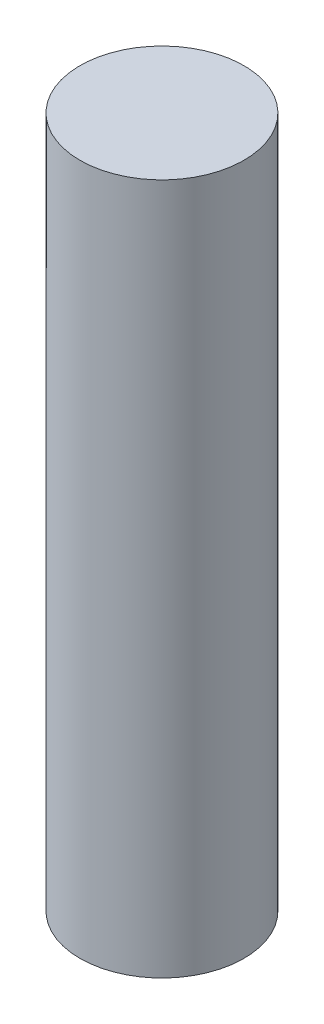
ISO-10303-21;
HEADER;
FILE_DESCRIPTION(('STEP AP214'),'2;1');
FILE_NAME('part.step','',(''),(''),'','','');
FILE_SCHEMA(('AUTOMOTIVE_DESIGN { 1 0 10303 214 1 1 1 1 }'));
ENDSEC;
DATA;
#1=APPLICATION_CONTEXT('core data for automotive mechanical design processes');
#2=APPLICATION_PROTOCOL_DEFINITION('international standard','automotive_design',2000,#1);
#3=PRODUCT_CONTEXT('',#1,'mechanical');
#4=PRODUCT('Part','Part','',(#3));
#5=PRODUCT_RELATED_PRODUCT_CATEGORY('part','',(#4));
#6=PRODUCT_DEFINITION_FORMATION('','',#4);
#7=PRODUCT_DEFINITION_CONTEXT('part definition',#1,'design');
#8=PRODUCT_DEFINITION('design','',#6,#7);
#9=PRODUCT_DEFINITION_SHAPE('','',#8);
#10=(LENGTH_UNIT() NAMED_UNIT(*) SI_UNIT(.MILLI.,.METRE.));
#11=(NAMED_UNIT(*) PLANE_ANGLE_UNIT() SI_UNIT($,.RADIAN.));
#12=(NAMED_UNIT(*) SI_UNIT($,.STERADIAN.) SOLID_ANGLE_UNIT());
#13=UNCERTAINTY_MEASURE_WITH_UNIT(LENGTH_MEASURE(1.E-05),#10,'distance_accuracy_value','');
#14=(GEOMETRIC_REPRESENTATION_CONTEXT(3) GLOBAL_UNCERTAINTY_ASSIGNED_CONTEXT((#13)) GLOBAL_UNIT_ASSIGNED_CONTEXT((#10,
#11,#12)) REPRESENTATION_CONTEXT('',''));
#15=CARTESIAN_POINT('',(0.,0.,0.));
#16=DIRECTION('',(0.,0.,1.));
#17=DIRECTION('',(1.,0.,0.));
#18=AXIS2_PLACEMENT_3D('',#15,#16,#17);
#19=CARTESIAN_POINT('',(0.,2950.,0.));
#20=DIRECTION('',(0.,-1.,0.));
#21=DIRECTION('',(0.,0.,-1.));
#22=AXIS2_PLACEMENT_3D('',#19,#20,#21);
#23=CYLINDRICAL_SURFACE('',#22,350.);
#24=CARTESIAN_POINT('',(0.,2950.,0.));
#25=DIRECTION('',(0.,1.,0.));
#26=DIRECTION('',(0.,0.,1.));
#27=AXIS2_PLACEMENT_3D('',#24,#25,#26);
#28=CIRCLE('',#27,350.);
#29=CARTESIAN_POINT('',(0.,2950.,350.));
#30=VERTEX_POINT('',#29);
#31=EDGE_CURVE('E10',#30,#30,#28,.T.);
#32=ORIENTED_EDGE('',*,*,#31,.F.);
#33=EDGE_LOOP('',(#32));
#34=FACE_BOUND('',#33,.T.);
#35=CARTESIAN_POINT('',(0.,0.,0.));
#36=DIRECTION('',(0.,1.,0.));
#37=DIRECTION('',(0.,0.,1.));
#38=AXIS2_PLACEMENT_3D('',#35,#36,#37);
#39=CIRCLE('',#38,350.);
#40=CARTESIAN_POINT('',(0.,0.,350.));
#41=VERTEX_POINT('',#40);
#42=EDGE_CURVE('E34',#41,#41,#39,.T.);
#43=ORIENTED_EDGE('',*,*,#42,.T.);
#44=EDGE_LOOP('',(#43));
#45=FACE_BOUND('',#44,.T.);
#46=ADVANCED_FACE('F31',(#34,#45),#23,.T.);
#47=CARTESIAN_POINT('',(0.,2950.,0.));
#48=DIRECTION('',(0.,1.,0.));
#49=DIRECTION('',(0.,0.,1.));
#50=AXIS2_PLACEMENT_3D('',#47,#48,#49);
#51=PLANE('',#50);
#52=ORIENTED_EDGE('',*,*,#31,.T.);
#53=EDGE_LOOP('',(#52));
#54=FACE_BOUND('',#53,.T.);
#55=ADVANCED_FACE('F46',(#54),#51,.T.);
#56=CARTESIAN_POINT('',(0.,0.,0.));
#57=DIRECTION('',(0.,1.,0.));
#58=DIRECTION('',(0.,0.,1.));
#59=AXIS2_PLACEMENT_3D('',#56,#57,#58);
#60=PLANE('',#59);
#61=ORIENTED_EDGE('',*,*,#42,.F.);
#62=EDGE_LOOP('',(#61));
#63=FACE_BOUND('',#62,.T.);
#64=ADVANCED_FACE('F44',(#63),#60,.F.);
#65=CLOSED_SHELL('',(#46,#55,#64));
#66=MANIFOLD_SOLID_BREP('B2',#65);
#67=ADVANCED_BREP_SHAPE_REPRESENTATION('',(#18,#66),#14);
#68=SHAPE_DEFINITION_REPRESENTATION(#9,#67);
ENDSEC;
END-ISO-10303-21;
